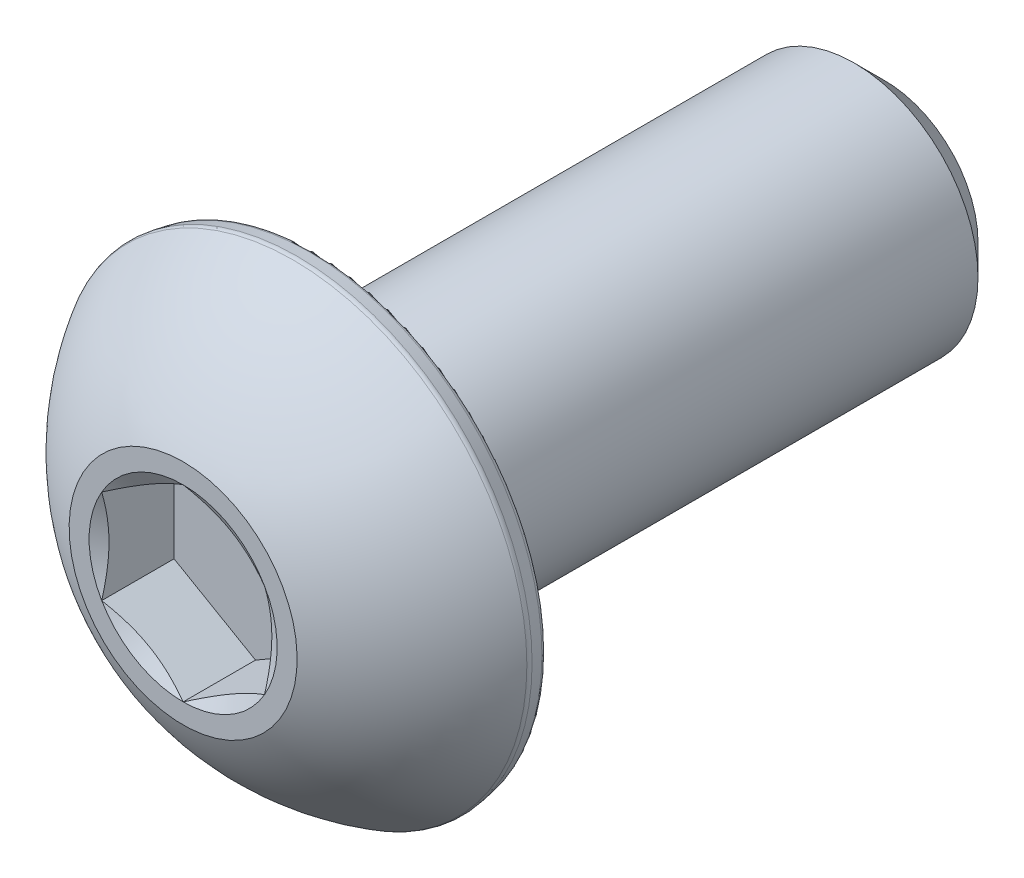
ISO-10303-21;
HEADER;
FILE_DESCRIPTION(('STEP AP214'),'2;1');
FILE_NAME('part.step','',(''),(''),'','','');
FILE_SCHEMA(('AUTOMOTIVE_DESIGN { 1 0 10303 214 1 1 1 1 }'));
ENDSEC;
DATA;
#1=APPLICATION_CONTEXT('core data for automotive mechanical design processes');
#2=APPLICATION_PROTOCOL_DEFINITION('international standard','automotive_design',2000,#1);
#3=PRODUCT_CONTEXT('',#1,'mechanical');
#4=PRODUCT('Part','Part','',(#3));
#5=PRODUCT_RELATED_PRODUCT_CATEGORY('part','',(#4));
#6=PRODUCT_DEFINITION_FORMATION('','',#4);
#7=PRODUCT_DEFINITION_CONTEXT('part definition',#1,'design');
#8=PRODUCT_DEFINITION('design','',#6,#7);
#9=PRODUCT_DEFINITION_SHAPE('','',#8);
#10=(LENGTH_UNIT() NAMED_UNIT(*) SI_UNIT(.MILLI.,.METRE.));
#11=(NAMED_UNIT(*) PLANE_ANGLE_UNIT() SI_UNIT($,.RADIAN.));
#12=(NAMED_UNIT(*) SI_UNIT($,.STERADIAN.) SOLID_ANGLE_UNIT());
#13=UNCERTAINTY_MEASURE_WITH_UNIT(LENGTH_MEASURE(1.E-05),#10,'distance_accuracy_value','');
#14=(GEOMETRIC_REPRESENTATION_CONTEXT(3) GLOBAL_UNCERTAINTY_ASSIGNED_CONTEXT((#13)) GLOBAL_UNIT_ASSIGNED_CONTEXT((#10,
#11,#12)) REPRESENTATION_CONTEXT('',''));
#15=CARTESIAN_POINT('',(0.,0.,0.));
#16=DIRECTION('',(0.,0.,1.));
#17=DIRECTION('',(1.,0.,0.));
#18=AXIS2_PLACEMENT_3D('',#15,#16,#17);
#19=CARTESIAN_POINT('',(0.,0.,6.83895));
#20=DIRECTION('',(0.,0.,-1.));
#21=DIRECTION('',(-1.,0.,0.));
#22=AXIS2_PLACEMENT_3D('',#19,#20,#21);
#23=PLANE('',#22);
#24=CARTESIAN_POINT('',(0.,0.,6.83895));
#25=DIRECTION('',(0.,0.,1.));
#26=DIRECTION('',(1.,0.,0.));
#27=AXIS2_PLACEMENT_3D('',#24,#25,#26);
#28=CIRCLE('',#27,1.83308710467706);
#29=CARTESIAN_POINT('',(-1.5875,0.916543552338531,6.83895));
#30=VERTEX_POINT('',#29);
#31=CARTESIAN_POINT('',(-1.5875,-0.916543552338531,6.83895));
#32=VERTEX_POINT('',#31);
#33=EDGE_CURVE('E100',#30,#32,#28,.T.);
#34=ORIENTED_EDGE('',*,*,#33,.F.);
#35=CARTESIAN_POINT('',(0.,1.83308710467706,6.83895));
#36=VERTEX_POINT('',#35);
#37=EDGE_CURVE('E110',#36,#30,#28,.T.);
#38=ORIENTED_EDGE('',*,*,#37,.F.);
#39=CARTESIAN_POINT('',(1.5875,0.916543552338532,6.83895));
#40=VERTEX_POINT('',#39);
#41=EDGE_CURVE('E60',#40,#36,#28,.T.);
#42=ORIENTED_EDGE('',*,*,#41,.F.);
#43=CARTESIAN_POINT('',(1.5875,-0.91654355233853,6.83895));
#44=VERTEX_POINT('',#43);
#45=EDGE_CURVE('E67',#44,#40,#28,.T.);
#46=ORIENTED_EDGE('',*,*,#45,.F.);
#47=CARTESIAN_POINT('',(0.,-1.83308710467706,6.83895));
#48=VERTEX_POINT('',#47);
#49=EDGE_CURVE('E146',#48,#44,#28,.T.);
#50=ORIENTED_EDGE('',*,*,#49,.F.);
#51=EDGE_CURVE('E111',#32,#48,#28,.T.);
#52=ORIENTED_EDGE('',*,*,#51,.F.);
#53=EDGE_LOOP('',(#34,#38,#42,#46,#50,#52));
#54=FACE_BOUND('',#53,.T.);
#55=CARTESIAN_POINT('',(0.,0.,6.83895));
#56=DIRECTION('',(0.,0.,1.));
#57=DIRECTION('',(1.,0.,0.));
#58=AXIS2_PLACEMENT_3D('',#55,#56,#57);
#59=CIRCLE('',#58,2.2225);
#60=CARTESIAN_POINT('',(0.,2.2225,6.83895));
#61=VERTEX_POINT('',#60);
#62=EDGE_CURVE('E123',#61,#61,#59,.T.);
#63=ORIENTED_EDGE('',*,*,#62,.T.);
#64=EDGE_LOOP('',(#63));
#65=FACE_BOUND('',#64,.T.);
#66=ADVANCED_FACE('F45',(#54,#65),#23,.F.);
#67=CARTESIAN_POINT('',(0.,0.,2.06158685789167));
#68=DIRECTION('',(0.,0.,1.));
#69=DIRECTION('',(0.,1.,0.));
#70=AXIS2_PLACEMENT_3D('',#67,#68,#69);
#71=SPHERICAL_SURFACE('',#70,5.26903262863072);
#72=CARTESIAN_POINT('',(0.,0.,4.69913865455147));
#73=DIRECTION('',(0.,0.,-1.));
#74=DIRECTION('',(-1.,0.,0.));
#75=AXIS2_PLACEMENT_3D('',#72,#73,#74);
#76=CIRCLE('',#75,4.56136222651872);
#77=CARTESIAN_POINT('',(0.,4.56136222651872,4.69913865455147));
#78=VERTEX_POINT('',#77);
#79=EDGE_CURVE('E122',#78,#78,#76,.F.);
#80=CARTESIAN_POINT('',(0.,4.56136222651872,4.69913865455147));
#81=CARTESIAN_POINT('',(0.,4.54457265342372,4.72817449967505));
#82=CARTESIAN_POINT('',(0.,4.52750576390844,4.75704998837534));
#83=CARTESIAN_POINT('',(0.,4.49282373362446,4.81446981794213));
#84=CARTESIAN_POINT('',(0.,4.47520859285576,4.84301415880862));
#85=CARTESIAN_POINT('',(0.,4.43943644165205,4.89976125772061));
#86=CARTESIAN_POINT('',(0.,4.42127943121704,4.9279640157661));
#87=CARTESIAN_POINT('',(0.,4.38443017344764,4.98401767097438));
#88=CARTESIAN_POINT('',(0.,4.36573792611325,5.01186856813717));
#89=CARTESIAN_POINT('',(0.,4.32782500814596,5.06720834316364));
#90=CARTESIAN_POINT('',(0.,4.30860433751306,5.09469722102732));
#91=CARTESIAN_POINT('',(0.,4.26964158309983,5.14930293338251));
#92=CARTESIAN_POINT('',(0.,4.2498994993195,5.17641976787403));
#93=CARTESIAN_POINT('',(0.,4.2099011178793,5.23027150446501));
#94=CARTESIAN_POINT('',(0.,4.18964482021943,5.25700640656448));
#95=CARTESIAN_POINT('',(0.,4.1486253980862,5.3100845288003));
#96=CARTESIAN_POINT('',(0.,4.12786227361285,5.33642774893666));
#97=CARTESIAN_POINT('',(0.,4.08583676967286,5.38871290046792));
#98=CARTESIAN_POINT('',(0.,4.06457439020622,5.41465483186283));
#99=CARTESIAN_POINT('',(0.,4.02155813018654,5.46612794548566));
#100=CARTESIAN_POINT('',(0.,3.99980424963349,5.49165912771358));
#101=CARTESIAN_POINT('',(0.,3.95581292058176,5.54230143236448));
#102=CARTESIAN_POINT('',(0.,3.93357547208306,5.56741255478747));
#103=CARTESIAN_POINT('',(0.,3.88862511662835,5.61720558237762));
#104=CARTESIAN_POINT('',(0.,3.86591220967234,5.64188748754479));
#105=CARTESIAN_POINT('',(0.,3.82001922017974,5.69081307969786));
#106=CARTESIAN_POINT('',(0.,3.79683913764316,5.71505676668378));
#107=CARTESIAN_POINT('',(0.,3.75002025023451,5.76309708135712));
#108=CARTESIAN_POINT('',(0.,3.72638144536245,5.78689370904456));
#109=CARTESIAN_POINT('',(0.,3.67865373381344,5.83403122703598));
#110=CARTESIAN_POINT('',(0.,3.65456482713649,5.85737211733997));
#111=CARTESIAN_POINT('',(0.,3.60594569665012,5.90358964867653));
#112=CARTESIAN_POINT('',(0.,3.5814154728407,5.92646628970911));
#113=CARTESIAN_POINT('',(0.,3.53192265370003,5.97174697991593));
#114=CARTESIAN_POINT('',(0.,3.50696005836878,5.99415102909018));
#115=CARTESIAN_POINT('',(0.,3.45661159947113,6.03847836533688));
#116=CARTESIAN_POINT('',(0.,3.43122573590471,6.06040165240934));
#117=CARTESIAN_POINT('',(0.,3.3800399981796,6.10375946953189));
#118=CARTESIAN_POINT('',(0.,3.35424012402089,6.12519399958198));
#119=CARTESIAN_POINT('',(0.,3.30223577373424,6.16756648597777));
#120=CARTESIAN_POINT('',(0.,3.2760312976063,6.18850444232345));
#121=CARTESIAN_POINT('',(0.,3.22322729955329,6.22987614571738));
#122=CARTESIAN_POINT('',(0.,3.19662777762822,6.25030989276562));
#123=CARTESIAN_POINT('',(0.,3.14304338821729,6.2906657258453));
#124=CARTESIAN_POINT('',(0.,3.11605852073142,6.31058781187675));
#125=CARTESIAN_POINT('',(0.,3.06171328096169,6.34991305779416));
#126=CARTESIAN_POINT('',(0.,3.03435290867784,6.36931621768012));
#127=CARTESIAN_POINT('',(0.,2.97926663701369,6.40759653541983));
#128=CARTESIAN_POINT('',(0.,2.9515407376334,6.42647369327358));
#129=CARTESIAN_POINT('',(0.,2.89573352277456,6.46369512287746));
#130=CARTESIAN_POINT('',(0.,2.86765220729601,6.48203939462759));
#131=CARTESIAN_POINT('',(0.,2.81114440086111,6.51818836230498));
#132=CARTESIAN_POINT('',(0.,2.78271790990477,6.53599305823225));
#133=CARTESIAN_POINT('',(0.,2.72553011897437,6.57105638123794));
#134=CARTESIAN_POINT('',(0.,2.69676881900032,6.58831500831637));
#135=CARTESIAN_POINT('',(0.,2.63892189873344,6.62227990002708));
#136=CARTESIAN_POINT('',(0.,2.6098362784406,6.63898616465936));
#137=CARTESIAN_POINT('',(0.,2.55135132397864,6.67184023823262));
#138=CARTESIAN_POINT('',(0.,2.52195198980951,6.6879880471736));
#139=CARTESIAN_POINT('',(0.,2.46285033041453,6.71971932381234));
#140=CARTESIAN_POINT('',(0.,2.43314800518868,6.73530279151011));
#141=CARTESIAN_POINT('',(0.,2.37345118963106,6.7658996908456));
#142=CARTESIAN_POINT('',(0.,2.34345669929928,6.78091312248334));
#143=CARTESIAN_POINT('',(0.,2.28318651350444,6.81036451899273));
#144=CARTESIAN_POINT('',(0.,2.25291081804138,6.82480248386439));
#145=CARTESIAN_POINT('',(0.,2.2225,6.83895));
#146=B_SPLINE_CURVE_WITH_KNOTS('',3,(#80,#81,#82,#83,#84,#85,#86,#87,#88,#89,#90,#91,#92,#93,
#94,#95,#96,#97,#98,#99,#100,#101,#102,#103,#104,#105,#106,#107,#108,#109,#110,#111,#112,#113,
#114,#115,#116,#117,#118,#119,#120,#121,#122,#123,#124,#125,#126,#127,#128,#129,#130,#131,#132,
#133,#134,#135,#136,#137,#138,#139,#140,#141,#142,#143,#144,#145),.UNSPECIFIED.,.F.,.F.,(4,2,2,
2,2,2,2,2,2,2,2,2,2,2,2,2,2,2,2,2,2,2,2,2,2,2,2,2,2,2,2,2,4),(0.,0.100620189020278,
0.201240378040557,0.301860567060833,0.402480756081111,0.503100945101389,0.603721134121667,
0.704341323141943,0.804961512162222,0.905581701182499,1.00620189020278,1.10682207922305,
1.20744226824333,1.30806245726361,1.40868264628389,1.50930283530417,1.60992302432444,
1.71054321334472,1.811163402365,1.91178359138528,2.01240378040555,2.11302396942583,
2.21364415844611,2.31426434746639,2.41488453648666,2.51550472550694,2.61612491452722,
2.7167451035475,2.81736529256777,2.91798548158805,3.01860567060833,3.11922585962861,
3.21984604864889),.UNSPECIFIED.);
#147=EDGE_CURVE('BSEAM224',#78,#61,#146,.T.);
#148=ORIENTED_EDGE('',*,*,#79,.T.);
#149=ORIENTED_EDGE('',*,*,#62,.F.);
#150=ORIENTED_EDGE('',*,*,#147,.T.);
#151=ORIENTED_EDGE('',*,*,#147,.F.);
#152=EDGE_LOOP('',(#148,#150,#149,#151));
#153=FACE_BOUND('',#152,.T.);
#154=ADVANCED_FACE('F224',(#153),#71,.T.);
#155=CARTESIAN_POINT('',(0.,0.,4.27355));
#156=DIRECTION('',(0.,0.,1.));
#157=DIRECTION('',(1.,0.,0.));
#158=AXIS2_PLACEMENT_3D('',#155,#156,#157);
#159=CONICAL_SURFACE('',#158,4.51684761455358,0.174532925199434);
#160=CARTESIAN_POINT('',(0.,0.,4.61265590663413));
#161=DIRECTION('',(0.,0.,-1.));
#162=DIRECTION('',(-1.,0.,0.));
#163=AXIS2_PLACEMENT_3D('',#160,#161,#162);
#164=CIRCLE('',#163,4.57664113521078);
#165=CARTESIAN_POINT('',(-4.57664113521078,0.,4.61265590663413));
#166=VERTEX_POINT('',#165);
#167=EDGE_CURVE('E54',#166,#166,#164,.T.);
#168=ORIENTED_EDGE('',*,*,#167,.T.);
#169=EDGE_LOOP('',(#168));
#170=FACE_BOUND('',#169,.T.);
#171=CARTESIAN_POINT('',(0.,0.,4.37954614825066));
#172=DIRECTION('',(0.,0.,-1.));
#173=DIRECTION('',(-1.,0.,0.));
#174=AXIS2_PLACEMENT_3D('',#171,#172,#173);
#175=CIRCLE('',#174,4.53553759534134);
#176=CARTESIAN_POINT('',(-4.53553759534134,0.,4.37954614825066));
#177=VERTEX_POINT('',#176);
#178=EDGE_CURVE('E250',#177,#177,#175,.F.);
#179=ORIENTED_EDGE('',*,*,#178,.T.);
#180=EDGE_LOOP('',(#179));
#181=FACE_BOUND('',#180,.T.);
#182=ADVANCED_FACE('F231',(#170,#181),#159,.T.);
#183=CARTESIAN_POINT('',(0.,4.51684761455358,4.27355));
#184=DIRECTION('',(0.,0.,1.));
#185=DIRECTION('',(1.,0.,0.));
#186=AXIS2_PLACEMENT_3D('',#183,#184,#185);
#187=PLANE('',#186);
#188=CARTESIAN_POINT('',(0.,0.,4.27355));
#189=DIRECTION('',(0.,0.,1.));
#190=DIRECTION('',(1.,0.,0.));
#191=AXIS2_PLACEMENT_3D('',#188,#189,#190);
#192=CIRCLE('',#191,4.40921630486247);
#193=CARTESIAN_POINT('',(4.40921630486247,0.,4.27355));
#194=VERTEX_POINT('',#193);
#195=EDGE_CURVE('E11',#194,#194,#192,.F.);
#196=ORIENTED_EDGE('',*,*,#195,.T.);
#197=EDGE_LOOP('',(#196));
#198=FACE_BOUND('',#197,.T.);
#199=CARTESIAN_POINT('',(0.,0.,4.27355));
#200=DIRECTION('',(0.,0.,1.));
#201=DIRECTION('',(1.,0.,0.));
#202=AXIS2_PLACEMENT_3D('',#199,#200,#201);
#203=CIRCLE('',#202,2.413);
#204=CARTESIAN_POINT('',(2.413,0.,4.27355));
#205=VERTEX_POINT('',#204);
#206=EDGE_CURVE('E328',#205,#205,#203,.T.);
#207=ORIENTED_EDGE('',*,*,#206,.T.);
#208=EDGE_LOOP('',(#207));
#209=FACE_BOUND('',#208,.T.);
#210=ADVANCED_FACE('F258',(#198,#209),#187,.F.);
#211=CARTESIAN_POINT('',(0.,0.,6.83895));
#212=DIRECTION('',(0.,0.,1.));
#213=DIRECTION('',(1.,0.,0.));
#214=AXIS2_PLACEMENT_3D('',#211,#212,#213);
#215=CYLINDRICAL_SURFACE('',#214,2.413);
#216=ORIENTED_EDGE('',*,*,#206,.F.);
#217=EDGE_LOOP('',(#216));
#218=FACE_BOUND('',#217,.T.);
#219=CARTESIAN_POINT('',(0.,0.,-6.24363749999999));
#220=DIRECTION('',(0.,0.,1.));
#221=DIRECTION('',(1.,0.,0.));
#222=AXIS2_PLACEMENT_3D('',#219,#220,#221);
#223=CIRCLE('',#222,2.413);
#224=CARTESIAN_POINT('',(2.413,0.,-6.24363749999999));
#225=VERTEX_POINT('',#224);
#226=EDGE_CURVE('E324',#225,#225,#223,.T.);
#227=ORIENTED_EDGE('',*,*,#226,.T.);
#228=EDGE_LOOP('',(#227));
#229=FACE_BOUND('',#228,.T.);
#230=ADVANCED_FACE('F263',(#218,#229),#215,.T.);
#231=CARTESIAN_POINT('',(0.,0.,-6.83895));
#232=DIRECTION('',(0.,0.,1.));
#233=DIRECTION('',(1.,0.,0.));
#234=AXIS2_PLACEMENT_3D('',#231,#232,#233);
#235=CONICAL_SURFACE('',#234,1.8176875,0.785398163397444);
#236=ORIENTED_EDGE('',*,*,#226,.F.);
#237=EDGE_LOOP('',(#236));
#238=FACE_BOUND('',#237,.T.);
#239=CARTESIAN_POINT('',(0.,0.,-6.83895));
#240=DIRECTION('',(0.,0.,1.));
#241=DIRECTION('',(1.,0.,0.));
#242=AXIS2_PLACEMENT_3D('',#239,#240,#241);
#243=CIRCLE('',#242,1.8176875);
#244=CARTESIAN_POINT('',(1.8176875,0.,-6.83895));
#245=VERTEX_POINT('',#244);
#246=EDGE_CURVE('E307',#245,#245,#243,.T.);
#247=ORIENTED_EDGE('',*,*,#246,.T.);
#248=EDGE_LOOP('',(#247));
#249=FACE_BOUND('',#248,.T.);
#250=ADVANCED_FACE('F269',(#238,#249),#235,.T.);
#251=CARTESIAN_POINT('',(0.,0.,-6.83895));
#252=DIRECTION('',(0.,0.,1.));
#253=DIRECTION('',(1.,0.,0.));
#254=AXIS2_PLACEMENT_3D('',#251,#252,#253);
#255=PLANE('',#254);
#256=ORIENTED_EDGE('',*,*,#246,.F.);
#257=EDGE_LOOP('',(#256));
#258=FACE_BOUND('',#257,.T.);
#259=ADVANCED_FACE('F273',(#258),#255,.F.);
#260=CARTESIAN_POINT('',(0.,0.,6.83895));
#261=DIRECTION('',(0.,0.,1.));
#262=DIRECTION('',(1.,0.,0.));
#263=AXIS2_PLACEMENT_3D('',#260,#261,#262);
#264=CONICAL_SURFACE('',#263,1.83308710467706,1.0471975511966);
#265=ORIENTED_EDGE('',*,*,#51,.T.);
#266=CARTESIAN_POINT('',(-1.5877,-0.916428082284693,6.83901667296548));
#267=CARTESIAN_POINT('',(-1.51793561383713,-0.956706569415676,6.8157507862806));
#268=CARTESIAN_POINT('',(-1.44756902994941,-0.997332735565202,6.79459084371131));
#269=CARTESIAN_POINT('',(-1.30561723674211,-1.07928864158539,6.75765488003136));
#270=CARTESIAN_POINT('',(-1.23402950399672,-1.12061983835662,6.74189192735861));
#271=CARTESIAN_POINT('',(-1.09174129077364,-1.20276997656347,6.7173531289101));
#272=CARTESIAN_POINT('',(-1.02106271077293,-1.24357627375282,6.70841398931757));
#273=CARTESIAN_POINT('',(-0.87937276149872,-1.32538100410775,6.69773997802977));
#274=CARTESIAN_POINT('',(-0.808361907681014,-1.36637913967479,6.6959962700179));
#275=CARTESIAN_POINT('',(-0.675659384402059,-1.44299497721204,6.69961202281142));
#276=CARTESIAN_POINT('',(-0.6139479110751,-1.47862411294944,6.70408369010886));
#277=CARTESIAN_POINT('',(-0.49092703935686,-1.54965024635191,6.71825990710371));
#278=CARTESIAN_POINT('',(-0.429618066887652,-1.58504699811075,6.72796930554132));
#279=CARTESIAN_POINT('',(-0.306343280023913,-1.65621972949082,6.7522434889126));
#280=CARTESIAN_POINT('',(-0.244393078468155,-1.69198669503539,6.76691123370721));
#281=CARTESIAN_POINT('',(-0.121416971719016,-1.7629869833709,6.80020179834348));
#282=CARTESIAN_POINT('',(-0.0603894894127829,-1.79822121670837,6.81881678939009));
#283=CARTESIAN_POINT('',(0.000200000000000363,-1.8332025747309,6.83901667296548));
#284=B_SPLINE_CURVE_WITH_KNOTS('',3,(#266,#267,#268,#269,#270,#271,#272,#273,#274,#275,#276,
#277,#278,#279,#280,#281,#282,#283),.UNSPECIFIED.,.F.,.F.,(4,2,2,2,2,2,2,2,4),(0.,
0.251647272601204,0.503899652171032,0.749908024753695,0.995614197816256,1.20960574360963,
1.42379572923035,1.64273857632785,1.86125117688),.UNSPECIFIED.);
#285=EDGE_CURVE('E116',#32,#48,#284,.T.);
#286=ORIENTED_EDGE('',*,*,#285,.F.);
#287=EDGE_LOOP('',(#265,#286));
#288=FACE_BOUND('',#287,.T.);
#289=ADVANCED_FACE('F117',(#288),#264,.F.);
#290=ORIENTED_EDGE('',*,*,#49,.T.);
#291=CARTESIAN_POINT('',(-0.000199999999999405,-1.8332025747309,6.83901667296548));
#292=CARTESIAN_POINT('',(0.0695643861628727,-1.79292408759992,6.8157507862806));
#293=CARTESIAN_POINT('',(0.139930970050586,-1.75229792145039,6.79459084371131));
#294=CARTESIAN_POINT('',(0.281882763257893,-1.6703420154302,6.75765488003136));
#295=CARTESIAN_POINT('',(0.353470496003283,-1.62901081865898,6.74189192735861));
#296=CARTESIAN_POINT('',(0.49575870922636,-1.54686068045212,6.7173531289101));
#297=CARTESIAN_POINT('',(0.56643728922707,-1.50605438326277,6.70841398931757));
#298=CARTESIAN_POINT('',(0.70812723850128,-1.42424965290784,6.69773997802977));
#299=CARTESIAN_POINT('',(0.779138092318986,-1.3832515173408,6.6959962700179));
#300=CARTESIAN_POINT('',(0.911840615597942,-1.30663567980356,6.69961202281142));
#301=CARTESIAN_POINT('',(0.9735520889249,-1.27100654406615,6.70408369010886));
#302=CARTESIAN_POINT('',(1.09657296064314,-1.19998041066368,6.71825990710371));
#303=CARTESIAN_POINT('',(1.15788193311235,-1.16458365890484,6.72796930554132));
#304=CARTESIAN_POINT('',(1.28115671997609,-1.09341092752477,6.7522434889126));
#305=CARTESIAN_POINT('',(1.34310692153184,-1.0576439619802,6.76691123370721));
#306=CARTESIAN_POINT('',(1.46608302828098,-0.986643673644694,6.80020179834348));
#307=CARTESIAN_POINT('',(1.52711051058722,-0.951409440307225,6.81881678939009));
#308=CARTESIAN_POINT('',(1.5877,-0.916428082284693,6.83901667296548));
#309=B_SPLINE_CURVE_WITH_KNOTS('',3,(#291,#292,#293,#294,#295,#296,#297,#298,#299,#300,#301,
#302,#303,#304,#305,#306,#307,#308),.UNSPECIFIED.,.F.,.F.,(4,2,2,2,2,2,2,2,4),(0.,
0.251647272601204,0.503899652171032,0.749908024753695,0.995614197816256,1.20960574360963,
1.42379572923035,1.64273857632785,1.86125117688),.UNSPECIFIED.);
#310=EDGE_CURVE('E151',#48,#44,#309,.T.);
#311=ORIENTED_EDGE('',*,*,#310,.F.);
#312=EDGE_LOOP('',(#290,#311));
#313=FACE_BOUND('',#312,.T.);
#314=ADVANCED_FACE('F359',(#313),#264,.F.);
#315=ORIENTED_EDGE('',*,*,#45,.T.);
#316=CARTESIAN_POINT('',(1.5875,-2.37354288027605,7.4292385208739));
#317=CARTESIAN_POINT('',(1.5875,-2.30498906897407,7.39634898494012));
#318=CARTESIAN_POINT('',(1.5875,-2.23626839223786,7.36380115002616));
#319=CARTESIAN_POINT('',(1.5875,-2.09840401641784,7.29958250631927));
#320=CARTESIAN_POINT('',(1.5875,-2.02926024390265,7.26791185536114));
#321=CARTESIAN_POINT('',(1.5875,-1.89006393379529,7.20546427433972));
#322=CARTESIAN_POINT('',(1.5875,-1.82000842787054,7.17469393099725));
#323=CARTESIAN_POINT('',(1.5875,-1.6793106951035,7.11453374032632));
#324=CARTESIAN_POINT('',(1.5875,-1.60866849899343,7.08514382121805));
#325=CARTESIAN_POINT('',(1.5875,-1.46481905678083,7.02736035940791));
#326=CARTESIAN_POINT('',(1.5875,-1.39159303106009,6.99901294635992));
#327=CARTESIAN_POINT('',(1.5875,-1.24427117679401,6.94468445621924));
#328=CARTESIAN_POINT('',(1.5875,-1.17017524056602,6.91870367564426));
#329=CARTESIAN_POINT('',(1.5875,-0.946703117236297,6.84540698206836));
#330=CARTESIAN_POINT('',(1.5875,-0.795733661821908,6.80256477310572));
#331=CARTESIAN_POINT('',(1.5875,-0.566258816268269,6.7528699166704));
#332=CARTESIAN_POINT('',(1.5875,-0.489336969230922,6.7387394569834));
#333=CARTESIAN_POINT('',(1.5875,-0.334627971891014,6.71630337237578));
#334=CARTESIAN_POINT('',(1.5875,-0.256840880424315,6.70799735382842));
#335=CARTESIAN_POINT('',(1.5875,-0.101768207486039,6.69797845192268));
#336=CARTESIAN_POINT('',(1.5875,-0.0244877840878069,6.69618776489765));
#337=CARTESIAN_POINT('',(1.5875,0.129945425556551,6.69914355861705));
#338=CARTESIAN_POINT('',(1.5875,0.207098203603201,6.70389044414429));
#339=CARTESIAN_POINT('',(1.5875,0.39746123117644,6.72325049566141));
#340=CARTESIAN_POINT('',(1.5875,0.510302581730162,6.74149178568133));
#341=CARTESIAN_POINT('',(1.5875,0.73379094829414,6.78853080938572));
#342=CARTESIAN_POINT('',(1.5875,0.844435149473762,6.81734126611763));
#343=CARTESIAN_POINT('',(1.5875,1.00991571828403,6.86655656656476));
#344=CARTESIAN_POINT('',(1.5875,1.06560747491338,6.88419114075268));
#345=CARTESIAN_POINT('',(1.5875,1.17641127317168,6.92109158822815));
#346=CARTESIAN_POINT('',(1.5875,1.23152365277664,6.94035644345908));
#347=CARTESIAN_POINT('',(1.5875,1.34124234685352,6.98023767066016));
#348=CARTESIAN_POINT('',(1.5875,1.39584875124712,7.00085379701296));
#349=CARTESIAN_POINT('',(1.5875,1.50463128017381,7.0432145699702));
#350=CARTESIAN_POINT('',(1.5875,1.55880733021518,7.06495940724256));
#351=CARTESIAN_POINT('',(1.5875,1.69709397430045,7.12185694848123));
#352=CARTESIAN_POINT('',(1.5875,1.78092805766898,7.15768097949698));
#353=CARTESIAN_POINT('',(1.5875,1.94783917261492,7.23105596773212));
#354=CARTESIAN_POINT('',(1.5875,2.03091614691811,7.26860705432267));
#355=CARTESIAN_POINT('',(1.5875,2.27926367299452,7.38324209065483));
#356=CARTESIAN_POINT('',(1.5875,2.44362308741275,7.46229606459347));
#357=CARTESIAN_POINT('',(1.5875,2.77093773989402,7.62371952259686));
#358=CARTESIAN_POINT('',(1.5875,2.93389100335284,7.70609296308095));
#359=CARTESIAN_POINT('',(1.5875,3.25868106672949,7.87295793046289));
#360=CARTESIAN_POINT('',(1.5875,3.42051800525884,7.95744918813148));
#361=CARTESIAN_POINT('',(1.5875,3.72818042196342,8.11984703230934));
#362=CARTESIAN_POINT('',(1.5875,3.87407539856249,8.19762241102382));
#363=CARTESIAN_POINT('',(1.5875,4.16539605096666,8.35405933862617));
#364=CARTESIAN_POINT('',(1.5875,4.31082170914626,8.43272092030889));
#365=CARTESIAN_POINT('',(1.5875,4.60094201771575,8.59050709578743));
#366=CARTESIAN_POINT('',(1.5875,4.74563758660809,8.66963000299539));
#367=CARTESIAN_POINT('',(1.5875,5.03473618489941,8.8283907922694));
#368=CARTESIAN_POINT('',(1.5875,5.1791392292114,8.9080286471689));
#369=CARTESIAN_POINT('',(1.5875,5.32343717609415,8.98785533452521));
#370=B_SPLINE_CURVE_WITH_KNOTS('',3,(#316,#317,#318,#319,#320,#321,#322,#323,#324,#325,#326,
#327,#328,#329,#330,#331,#332,#333,#334,#335,#336,#337,#338,#339,#340,#341,#342,#343,#344,#345,
#346,#347,#348,#349,#350,#351,#352,#353,#354,#355,#356,#357,#358,#359,#360,#361,#362,#363,#364,
#365,#366,#367,#368,#369),.UNSPECIFIED.,.F.,.F.,(4,2,2,2,2,2,2,2,2,2,2,2,2,2,2,2,2,2,2,2,2,2,2,
2,2,2,4),(0.,0.228108416316536,0.456257613800003,0.685790772408023,0.915311982421997,
1.15083308117179,1.38638364812083,1.85615598568852,2.09060484106677,2.3250378504203,
2.55666198604243,2.78830046363685,3.13051568227743,3.47314421494376,3.6483760219735,
3.82349919880257,3.99859063171139,4.17371173887894,4.44718606585054,4.72068091184658,
5.267760937063,5.81551351008619,6.36319679928459,6.85918646152392,7.35519453905288,
7.84994100628722,8.34466158226601),.UNSPECIFIED.);
#371=EDGE_CURVE('E161',#44,#40,#370,.T.);
#372=ORIENTED_EDGE('',*,*,#371,.F.);
#373=EDGE_LOOP('',(#315,#372));
#374=FACE_BOUND('',#373,.T.);
#375=ADVANCED_FACE('F355',(#374),#264,.F.);
#376=ORIENTED_EDGE('',*,*,#41,.T.);
#377=CARTESIAN_POINT('',(1.5877,0.916428082284694,6.83901667296548));
#378=CARTESIAN_POINT('',(1.51793561383713,0.956706569415677,6.81575078628061));
#379=CARTESIAN_POINT('',(1.44756902994941,0.997332735565203,6.79459084371131));
#380=CARTESIAN_POINT('',(1.30561723674211,1.07928864158539,6.75765488003136));
#381=CARTESIAN_POINT('',(1.23402950399672,1.12061983835662,6.74189192735861));
#382=CARTESIAN_POINT('',(1.09174129077364,1.20276997656347,6.7173531289101));
#383=CARTESIAN_POINT('',(1.02106271077293,1.24357627375282,6.70841398931757));
#384=CARTESIAN_POINT('',(0.87937276149872,1.32538100410775,6.69773997802977));
#385=CARTESIAN_POINT('',(0.808361907681014,1.36637913967479,6.6959962700179));
#386=CARTESIAN_POINT('',(0.675659384402059,1.44299497721204,6.69961202281142));
#387=CARTESIAN_POINT('',(0.6139479110751,1.47862411294945,6.70408369010886));
#388=CARTESIAN_POINT('',(0.490927039356861,1.54965024635191,6.71825990710371));
#389=CARTESIAN_POINT('',(0.429618066887652,1.58504699811075,6.72796930554133));
#390=CARTESIAN_POINT('',(0.306343280023913,1.65621972949082,6.7522434889126));
#391=CARTESIAN_POINT('',(0.244393078468155,1.69198669503539,6.76691123370721));
#392=CARTESIAN_POINT('',(0.121416971719016,1.7629869833709,6.80020179834348));
#393=CARTESIAN_POINT('',(0.0603894894127827,1.79822121670837,6.81881678939009));
#394=CARTESIAN_POINT('',(-0.000200000000000523,1.8332025747309,6.83901667296548));
#395=B_SPLINE_CURVE_WITH_KNOTS('',3,(#377,#378,#379,#380,#381,#382,#383,#384,#385,#386,#387,
#388,#389,#390,#391,#392,#393,#394),.UNSPECIFIED.,.F.,.F.,(4,2,2,2,2,2,2,2,4),(0.,
0.251647272601204,0.503899652171032,0.749908024753695,0.995614197816257,1.20960574360963,
1.42379572923035,1.64273857632785,1.86125117688),.UNSPECIFIED.);
#396=EDGE_CURVE('E188',#40,#36,#395,.T.);
#397=ORIENTED_EDGE('',*,*,#396,.F.);
#398=EDGE_LOOP('',(#376,#397));
#399=FACE_BOUND('',#398,.T.);
#400=ADVANCED_FACE('F351',(#399),#264,.F.);
#401=ORIENTED_EDGE('',*,*,#37,.T.);
#402=CARTESIAN_POINT('',(0.000199999999999306,1.8332025747309,6.83901667296548));
#403=CARTESIAN_POINT('',(-0.0695643861628729,1.79292408759992,6.81575078628061));
#404=CARTESIAN_POINT('',(-0.139930970050586,1.75229792145039,6.79459084371131));
#405=CARTESIAN_POINT('',(-0.281882763257893,1.6703420154302,6.75765488003136));
#406=CARTESIAN_POINT('',(-0.353470496003283,1.62901081865898,6.74189192735861));
#407=CARTESIAN_POINT('',(-0.49575870922636,1.54686068045212,6.7173531289101));
#408=CARTESIAN_POINT('',(-0.56643728922707,1.50605438326277,6.70841398931757));
#409=CARTESIAN_POINT('',(-0.70812723850128,1.42424965290784,6.69773997802977));
#410=CARTESIAN_POINT('',(-0.779138092318986,1.3832515173408,6.6959962700179));
#411=CARTESIAN_POINT('',(-0.911840615597942,1.30663567980356,6.69961202281142));
#412=CARTESIAN_POINT('',(-0.9735520889249,1.27100654406615,6.70408369010886));
#413=CARTESIAN_POINT('',(-1.09657296064314,1.19998041066368,6.71825990710371));
#414=CARTESIAN_POINT('',(-1.15788193311235,1.16458365890484,6.72796930554133));
#415=CARTESIAN_POINT('',(-1.28115671997609,1.09341092752477,6.7522434889126));
#416=CARTESIAN_POINT('',(-1.34310692153184,1.0576439619802,6.76691123370721));
#417=CARTESIAN_POINT('',(-1.46608302828098,0.986643673644694,6.80020179834348));
#418=CARTESIAN_POINT('',(-1.52711051058722,0.951409440307226,6.81881678939009));
#419=CARTESIAN_POINT('',(-1.5877,0.916428082284693,6.83901667296548));
#420=B_SPLINE_CURVE_WITH_KNOTS('',3,(#402,#403,#404,#405,#406,#407,#408,#409,#410,#411,#412,
#413,#414,#415,#416,#417,#418,#419),.UNSPECIFIED.,.F.,.F.,(4,2,2,2,2,2,2,2,4),(0.,
0.251647272601204,0.503899652171032,0.749908024753695,0.995614197816257,1.20960574360963,
1.42379572923035,1.64273857632785,1.86125117688),.UNSPECIFIED.);
#421=EDGE_CURVE('E134',#36,#30,#420,.T.);
#422=ORIENTED_EDGE('',*,*,#421,.F.);
#423=EDGE_LOOP('',(#401,#422));
#424=FACE_BOUND('',#423,.T.);
#425=ADVANCED_FACE('F175',(#424),#264,.F.);
#426=ORIENTED_EDGE('',*,*,#33,.T.);
#427=CARTESIAN_POINT('',(-1.5875,-2.37354288027605,7.4292385208739));
#428=CARTESIAN_POINT('',(-1.5875,-2.30498906897407,7.39634898494012));
#429=CARTESIAN_POINT('',(-1.5875,-2.23626839223786,7.36380115002616));
#430=CARTESIAN_POINT('',(-1.5875,-2.09840401641784,7.29958250631927));
#431=CARTESIAN_POINT('',(-1.5875,-2.02926024390265,7.26791185536114));
#432=CARTESIAN_POINT('',(-1.5875,-1.89006393379529,7.20546427433972));
#433=CARTESIAN_POINT('',(-1.5875,-1.82000842787054,7.17469393099725));
#434=CARTESIAN_POINT('',(-1.5875,-1.6793106951035,7.11453374032632));
#435=CARTESIAN_POINT('',(-1.5875,-1.60866849899343,7.08514382121805));
#436=CARTESIAN_POINT('',(-1.5875,-1.46481905678083,7.02736035940791));
#437=CARTESIAN_POINT('',(-1.5875,-1.39159303106009,6.99901294635992));
#438=CARTESIAN_POINT('',(-1.5875,-1.24427117679401,6.94468445621924));
#439=CARTESIAN_POINT('',(-1.5875,-1.17017524056603,6.91870367564426));
#440=CARTESIAN_POINT('',(-1.5875,-0.946703117236298,6.84540698206836));
#441=CARTESIAN_POINT('',(-1.5875,-0.795733661821908,6.80256477310572));
#442=CARTESIAN_POINT('',(-1.5875,-0.56625881626827,6.7528699166704));
#443=CARTESIAN_POINT('',(-1.5875,-0.489336969230923,6.7387394569834));
#444=CARTESIAN_POINT('',(-1.5875,-0.334627971891014,6.71630337237578));
#445=CARTESIAN_POINT('',(-1.5875,-0.256840880424316,6.70799735382842));
#446=CARTESIAN_POINT('',(-1.5875,-0.10176820748604,6.69797845192268));
#447=CARTESIAN_POINT('',(-1.5875,-0.0244877840878075,6.69618776489765));
#448=CARTESIAN_POINT('',(-1.5875,0.129945425556551,6.69914355861705));
#449=CARTESIAN_POINT('',(-1.5875,0.2070982036032,6.70389044414429));
#450=CARTESIAN_POINT('',(-1.5875,0.39746123117644,6.72325049566141));
#451=CARTESIAN_POINT('',(-1.5875,0.510302581730161,6.74149178568133));
#452=CARTESIAN_POINT('',(-1.5875,0.733790948294139,6.78853080938572));
#453=CARTESIAN_POINT('',(-1.5875,0.844435149473761,6.81734126611763));
#454=CARTESIAN_POINT('',(-1.5875,1.00991571828403,6.86655656656476));
#455=CARTESIAN_POINT('',(-1.5875,1.06560747491337,6.88419114075268));
#456=CARTESIAN_POINT('',(-1.5875,1.17641127317168,6.92109158822815));
#457=CARTESIAN_POINT('',(-1.5875,1.23152365277664,6.94035644345908));
#458=CARTESIAN_POINT('',(-1.5875,1.34124234685352,6.98023767066016));
#459=CARTESIAN_POINT('',(-1.5875,1.39584875124712,7.00085379701296));
#460=CARTESIAN_POINT('',(-1.5875,1.5046312801738,7.0432145699702));
#461=CARTESIAN_POINT('',(-1.5875,1.55880733021518,7.06495940724256));
#462=CARTESIAN_POINT('',(-1.5875,1.69709397430045,7.12185694848123));
#463=CARTESIAN_POINT('',(-1.5875,1.78092805766898,7.15768097949698));
#464=CARTESIAN_POINT('',(-1.5875,1.94783917261492,7.23105596773212));
#465=CARTESIAN_POINT('',(-1.5875,2.03091614691811,7.26860705432267));
#466=CARTESIAN_POINT('',(-1.5875,2.27926367299452,7.38324209065483));
#467=CARTESIAN_POINT('',(-1.5875,2.44362308741275,7.46229606459347));
#468=CARTESIAN_POINT('',(-1.5875,2.77093773989402,7.62371952259686));
#469=CARTESIAN_POINT('',(-1.5875,2.93389100335284,7.70609296308095));
#470=CARTESIAN_POINT('',(-1.5875,3.25868106672949,7.87295793046289));
#471=CARTESIAN_POINT('',(-1.5875,3.42051800525884,7.95744918813148));
#472=CARTESIAN_POINT('',(-1.5875,3.72818042196342,8.11984703230934));
#473=CARTESIAN_POINT('',(-1.5875,3.87407539856249,8.19762241102382));
#474=CARTESIAN_POINT('',(-1.5875,4.16539605096666,8.35405933862617));
#475=CARTESIAN_POINT('',(-1.5875,4.31082170914626,8.43272092030889));
#476=CARTESIAN_POINT('',(-1.5875,4.60094201771575,8.59050709578743));
#477=CARTESIAN_POINT('',(-1.5875,4.74563758660809,8.66963000299538));
#478=CARTESIAN_POINT('',(-1.5875,5.03473618489941,8.8283907922694));
#479=CARTESIAN_POINT('',(-1.5875,5.1791392292114,8.9080286471689));
#480=CARTESIAN_POINT('',(-1.5875,5.32343717609415,8.98785533452521));
#481=B_SPLINE_CURVE_WITH_KNOTS('',3,(#427,#428,#429,#430,#431,#432,#433,#434,#435,#436,#437,
#438,#439,#440,#441,#442,#443,#444,#445,#446,#447,#448,#449,#450,#451,#452,#453,#454,#455,#456,
#457,#458,#459,#460,#461,#462,#463,#464,#465,#466,#467,#468,#469,#470,#471,#472,#473,#474,#475,
#476,#477,#478,#479,#480),.UNSPECIFIED.,.F.,.F.,(4,2,2,2,2,2,2,2,2,2,2,2,2,2,2,2,2,2,2,2,2,2,2,
2,2,2,4),(0.,0.228108416316536,0.456257613800003,0.685790772408022,0.915311982421996,
1.15083308117179,1.38638364812082,1.85615598568851,2.09060484106677,2.3250378504203,
2.55666198604243,2.78830046363685,3.13051568227743,3.47314421494376,3.6483760219735,
3.82349919880256,3.99859063171139,4.17371173887894,4.44718606585054,4.72068091184658,
5.267760937063,5.81551351008619,6.36319679928459,6.85918646152392,7.35519453905289,
7.84994100628722,8.34466158226601),.UNSPECIFIED.);
#482=EDGE_CURVE('E104',#30,#32,#481,.F.);
#483=ORIENTED_EDGE('',*,*,#482,.F.);
#484=EDGE_LOOP('',(#426,#483));
#485=FACE_BOUND('',#484,.T.);
#486=ADVANCED_FACE('F102',(#485),#264,.F.);
#487=CARTESIAN_POINT('',(0.,0.,5.42798));
#488=DIRECTION('',(0.,0.,1.));
#489=DIRECTION('',(1.,0.,0.));
#490=AXIS2_PLACEMENT_3D('',#487,#488,#489);
#491=PLANE('',#490);
#492=DIRECTION('',(0.,-1.,0.));
#493=VECTOR('',#492,1.);
#494=CARTESIAN_POINT('',(-1.5875,0.916543552338531,5.42798));
#495=LINE('',#494,#493);
#496=CARTESIAN_POINT('',(-1.5875,0.916543552338531,5.42798));
#497=VERTEX_POINT('',#496);
#498=CARTESIAN_POINT('',(-1.5875,-0.916543552338531,5.42798));
#499=VERTEX_POINT('',#498);
#500=EDGE_CURVE('E133',#497,#499,#495,.T.);
#501=ORIENTED_EDGE('',*,*,#500,.T.);
#502=DIRECTION('',(0.866025403784439,-0.5,0.));
#503=VECTOR('',#502,1.);
#504=CARTESIAN_POINT('',(-1.5875,-0.916543552338531,5.42798));
#505=LINE('',#504,#503);
#506=CARTESIAN_POINT('',(0.,-1.83308710467706,5.42798));
#507=VERTEX_POINT('',#506);
#508=EDGE_CURVE('E138',#499,#507,#505,.T.);
#509=ORIENTED_EDGE('',*,*,#508,.T.);
#510=DIRECTION('',(0.866025403784438,0.5,0.));
#511=VECTOR('',#510,1.);
#512=CARTESIAN_POINT('',(0.,-1.83308710467706,5.42798));
#513=LINE('',#512,#511);
#514=CARTESIAN_POINT('',(1.5875,-0.91654355233853,5.42798));
#515=VERTEX_POINT('',#514);
#516=EDGE_CURVE('E291',#507,#515,#513,.T.);
#517=ORIENTED_EDGE('',*,*,#516,.T.);
#518=DIRECTION('',(0.,1.,0.));
#519=VECTOR('',#518,1.);
#520=CARTESIAN_POINT('',(1.5875,-0.91654355233853,5.42798));
#521=LINE('',#520,#519);
#522=CARTESIAN_POINT('',(1.5875,0.916543552338532,5.42798));
#523=VERTEX_POINT('',#522);
#524=EDGE_CURVE('E296',#515,#523,#521,.T.);
#525=ORIENTED_EDGE('',*,*,#524,.T.);
#526=DIRECTION('',(-0.866025403784439,0.5,0.));
#527=VECTOR('',#526,1.);
#528=CARTESIAN_POINT('',(1.5875,0.916543552338532,5.42798));
#529=LINE('',#528,#527);
#530=CARTESIAN_POINT('',(0.,1.83308710467706,5.42798));
#531=VERTEX_POINT('',#530);
#532=EDGE_CURVE('E300',#523,#531,#529,.T.);
#533=ORIENTED_EDGE('',*,*,#532,.T.);
#534=DIRECTION('',(-0.866025403784438,-0.5,0.));
#535=VECTOR('',#534,1.);
#536=CARTESIAN_POINT('',(0.,1.83308710467706,5.42798));
#537=LINE('',#536,#535);
#538=EDGE_CURVE('E142',#531,#497,#537,.T.);
#539=ORIENTED_EDGE('',*,*,#538,.T.);
#540=EDGE_LOOP('',(#501,#509,#517,#525,#533,#539));
#541=FACE_BOUND('',#540,.T.);
#542=ADVANCED_FACE('F174',(#541),#491,.T.);
#543=CARTESIAN_POINT('',(-1.5875,-0.916543552338531,5.42798));
#544=DIRECTION('',(-0.5,-0.866025403784439,0.));
#545=DIRECTION('',(0.866025403784439,-0.5,0.));
#546=AXIS2_PLACEMENT_3D('',#543,#544,#545);
#547=PLANE('',#546);
#548=DIRECTION('',(0.,0.,1.));
#549=VECTOR('',#548,1.);
#550=CARTESIAN_POINT('',(-1.5875,-0.916543552338531,5.42798));
#551=LINE('',#550,#549);
#552=EDGE_CURVE('E128',#499,#32,#551,.T.);
#553=ORIENTED_EDGE('',*,*,#552,.T.);
#554=ORIENTED_EDGE('',*,*,#285,.T.);
#555=DIRECTION('',(0.,0.,1.));
#556=VECTOR('',#555,1.);
#557=CARTESIAN_POINT('',(0.,-1.83308710467706,5.42798));
#558=LINE('',#557,#556);
#559=EDGE_CURVE('E141',#507,#48,#558,.T.);
#560=ORIENTED_EDGE('',*,*,#559,.F.);
#561=ORIENTED_EDGE('',*,*,#508,.F.);
#562=EDGE_LOOP('',(#553,#554,#560,#561));
#563=FACE_BOUND('',#562,.T.);
#564=ADVANCED_FACE('F136',(#563),#547,.F.);
#565=CARTESIAN_POINT('',(0.,-1.83308710467706,5.42798));
#566=DIRECTION('',(0.5,-0.866025403784438,0.));
#567=DIRECTION('',(0.866025403784439,0.5,0.));
#568=AXIS2_PLACEMENT_3D('',#565,#566,#567);
#569=PLANE('',#568);
#570=ORIENTED_EDGE('',*,*,#559,.T.);
#571=ORIENTED_EDGE('',*,*,#310,.T.);
#572=DIRECTION('',(0.,0.,1.));
#573=VECTOR('',#572,1.);
#574=CARTESIAN_POINT('',(1.5875,-0.91654355233853,5.42798));
#575=LINE('',#574,#573);
#576=EDGE_CURVE('E316',#515,#44,#575,.T.);
#577=ORIENTED_EDGE('',*,*,#576,.F.);
#578=ORIENTED_EDGE('',*,*,#516,.F.);
#579=EDGE_LOOP('',(#570,#571,#577,#578));
#580=FACE_BOUND('',#579,.T.);
#581=ADVANCED_FACE('F168',(#580),#569,.F.);
#582=CARTESIAN_POINT('',(1.5875,-0.91654355233853,5.42798));
#583=DIRECTION('',(1.,0.,0.));
#584=DIRECTION('',(0.,1.,0.));
#585=AXIS2_PLACEMENT_3D('',#582,#583,#584);
#586=PLANE('',#585);
#587=ORIENTED_EDGE('',*,*,#576,.T.);
#588=ORIENTED_EDGE('',*,*,#371,.T.);
#589=DIRECTION('',(0.,0.,1.));
#590=VECTOR('',#589,1.);
#591=CARTESIAN_POINT('',(1.5875,0.916543552338532,5.42798));
#592=LINE('',#591,#590);
#593=EDGE_CURVE('E312',#523,#40,#592,.T.);
#594=ORIENTED_EDGE('',*,*,#593,.F.);
#595=ORIENTED_EDGE('',*,*,#524,.F.);
#596=EDGE_LOOP('',(#587,#588,#594,#595));
#597=FACE_BOUND('',#596,.T.);
#598=ADVANCED_FACE('F213',(#597),#586,.F.);
#599=CARTESIAN_POINT('',(1.5875,0.916543552338532,5.42798));
#600=DIRECTION('',(0.5,0.866025403784439,0.));
#601=DIRECTION('',(-0.866025403784439,0.5,0.));
#602=AXIS2_PLACEMENT_3D('',#599,#600,#601);
#603=PLANE('',#602);
#604=ORIENTED_EDGE('',*,*,#593,.T.);
#605=ORIENTED_EDGE('',*,*,#396,.T.);
#606=DIRECTION('',(0.,0.,1.));
#607=VECTOR('',#606,1.);
#608=CARTESIAN_POINT('',(0.,1.83308710467706,5.42798));
#609=LINE('',#608,#607);
#610=EDGE_CURVE('E308',#531,#36,#609,.T.);
#611=ORIENTED_EDGE('',*,*,#610,.F.);
#612=ORIENTED_EDGE('',*,*,#532,.F.);
#613=EDGE_LOOP('',(#604,#605,#611,#612));
#614=FACE_BOUND('',#613,.T.);
#615=ADVANCED_FACE('F209',(#614),#603,.F.);
#616=CARTESIAN_POINT('',(0.,1.83308710467706,5.42798));
#617=DIRECTION('',(-0.5,0.866025403784438,0.));
#618=DIRECTION('',(-0.866025403784439,-0.5,0.));
#619=AXIS2_PLACEMENT_3D('',#616,#617,#618);
#620=PLANE('',#619);
#621=ORIENTED_EDGE('',*,*,#610,.T.);
#622=ORIENTED_EDGE('',*,*,#421,.T.);
#623=DIRECTION('',(0.,0.,1.));
#624=VECTOR('',#623,1.);
#625=CARTESIAN_POINT('',(-1.5875,0.916543552338531,5.42798));
#626=LINE('',#625,#624);
#627=EDGE_CURVE('E130',#497,#30,#626,.T.);
#628=ORIENTED_EDGE('',*,*,#627,.F.);
#629=ORIENTED_EDGE('',*,*,#538,.F.);
#630=EDGE_LOOP('',(#621,#622,#628,#629));
#631=FACE_BOUND('',#630,.T.);
#632=ADVANCED_FACE('F206',(#631),#620,.F.);
#633=CARTESIAN_POINT('',(-1.5875,0.916543552338531,5.42798));
#634=DIRECTION('',(-1.,0.,0.));
#635=DIRECTION('',(0.,0.,1.));
#636=AXIS2_PLACEMENT_3D('',#633,#634,#635);
#637=PLANE('',#636);
#638=ORIENTED_EDGE('',*,*,#627,.T.);
#639=ORIENTED_EDGE('',*,*,#482,.T.);
#640=ORIENTED_EDGE('',*,*,#552,.F.);
#641=ORIENTED_EDGE('',*,*,#500,.F.);
#642=EDGE_LOOP('',(#638,#639,#640,#641));
#643=FACE_BOUND('',#642,.T.);
#644=ADVANCED_FACE('F126',(#643),#637,.F.);
#645=CARTESIAN_POINT('',(0.,0.,4.63492975838346));
#646=DIRECTION('',(0.,0.,-1.));
#647=DIRECTION('',(-1.,0.,0.));
#648=AXIS2_PLACEMENT_3D('',#645,#646,#647);
#649=TOROIDAL_SURFACE('',#648,4.4503198447319,0.12827);
#650=ORIENTED_EDGE('',*,*,#167,.F.);
#651=EDGE_LOOP('',(#650));
#652=FACE_BOUND('',#651,.T.);
#653=ORIENTED_EDGE('',*,*,#79,.F.);
#654=EDGE_LOOP('',(#653));
#655=FACE_BOUND('',#654,.T.);
#656=ADVANCED_FACE('F235',(#652,#655),#649,.T.);
#657=CARTESIAN_POINT('',(0.,0.,4.40182));
#658=DIRECTION('',(0.,0.,1.));
#659=DIRECTION('',(1.,0.,0.));
#660=AXIS2_PLACEMENT_3D('',#657,#658,#659);
#661=TOROIDAL_SURFACE('',#660,4.40921630486247,0.12827);
#662=ORIENTED_EDGE('',*,*,#195,.F.);
#663=EDGE_LOOP('',(#662));
#664=FACE_BOUND('',#663,.T.);
#665=ORIENTED_EDGE('',*,*,#178,.F.);
#666=EDGE_LOOP('',(#665));
#667=FACE_BOUND('',#666,.T.);
#668=ADVANCED_FACE('F47',(#664,#667),#661,.T.);
#669=CLOSED_SHELL('',(#66,#154,#182,#210,#230,#250,#259,#289,#314,#375,#400,#425,#486,#542,#564,
#581,#598,#615,#632,#644,#656,#668));
#670=MANIFOLD_SOLID_BREP('B2',#669);
#671=ADVANCED_BREP_SHAPE_REPRESENTATION('',(#18,#670),#14);
#672=SHAPE_DEFINITION_REPRESENTATION(#9,#671);
ENDSEC;
END-ISO-10303-21;
